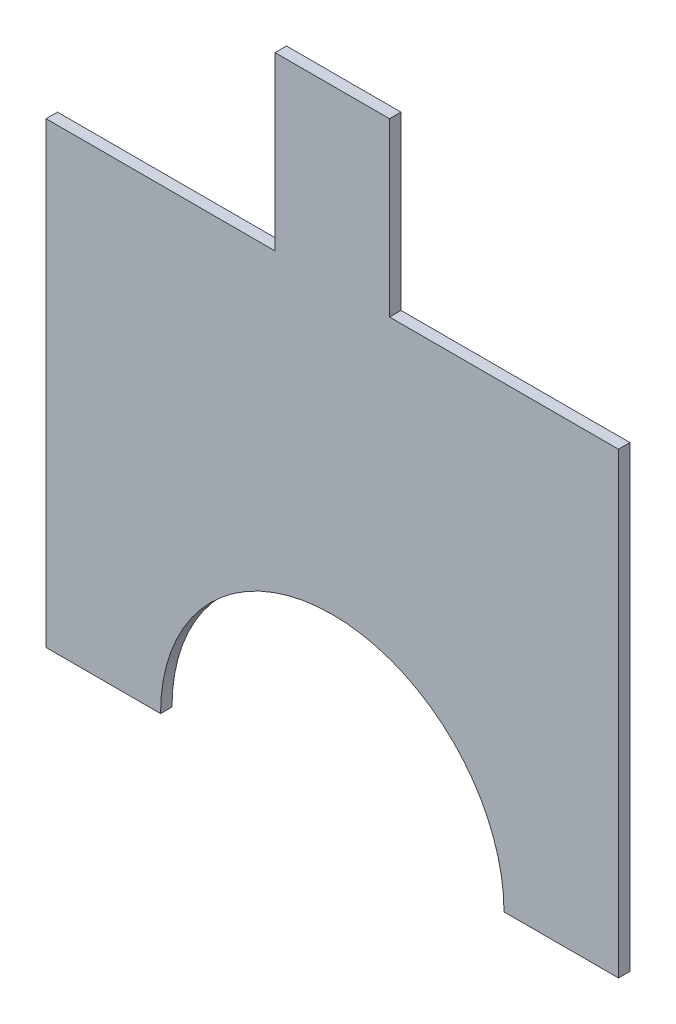
ISO-10303-21;
HEADER;
FILE_DESCRIPTION(('STEP AP214'),'2;1');
FILE_NAME('part.step','',(''),(''),'','','');
FILE_SCHEMA(('AUTOMOTIVE_DESIGN { 1 0 10303 214 1 1 1 1 }'));
ENDSEC;
DATA;
#1=APPLICATION_CONTEXT('core data for automotive mechanical design processes');
#2=APPLICATION_PROTOCOL_DEFINITION('international standard','automotive_design',2000,#1);
#3=PRODUCT_CONTEXT('',#1,'mechanical');
#4=PRODUCT('Part','Part','',(#3));
#5=PRODUCT_RELATED_PRODUCT_CATEGORY('part','',(#4));
#6=PRODUCT_DEFINITION_FORMATION('','',#4);
#7=PRODUCT_DEFINITION_CONTEXT('part definition',#1,'design');
#8=PRODUCT_DEFINITION('design','',#6,#7);
#9=PRODUCT_DEFINITION_SHAPE('','',#8);
#10=(LENGTH_UNIT() NAMED_UNIT(*) SI_UNIT(.MILLI.,.METRE.));
#11=(NAMED_UNIT(*) PLANE_ANGLE_UNIT() SI_UNIT($,.RADIAN.));
#12=(NAMED_UNIT(*) SI_UNIT($,.STERADIAN.) SOLID_ANGLE_UNIT());
#13=UNCERTAINTY_MEASURE_WITH_UNIT(LENGTH_MEASURE(1.E-05),#10,'distance_accuracy_value','');
#14=(GEOMETRIC_REPRESENTATION_CONTEXT(3) GLOBAL_UNCERTAINTY_ASSIGNED_CONTEXT((#13)) GLOBAL_UNIT_ASSIGNED_CONTEXT((#10,
#11,#12)) REPRESENTATION_CONTEXT('',''));
#15=CARTESIAN_POINT('',(0.,0.,0.));
#16=DIRECTION('',(0.,0.,1.));
#17=DIRECTION('',(1.,0.,0.));
#18=AXIS2_PLACEMENT_3D('',#15,#16,#17);
#19=CARTESIAN_POINT('',(-0.7,-0.800000000000001,0.01));
#20=DIRECTION('',(1.,0.,0.));
#21=DIRECTION('',(0.,0.,-1.));
#22=AXIS2_PLACEMENT_3D('',#19,#20,#21);
#23=PLANE('',#22);
#24=DIRECTION('',(0.,-1.,0.));
#25=VECTOR('',#24,1.);
#26=CARTESIAN_POINT('',(-0.7,-0.800000000000001,0.));
#27=LINE('',#26,#25);
#28=CARTESIAN_POINT('',(-0.7,-0.400000000000001,0.));
#29=VERTEX_POINT('',#28);
#30=CARTESIAN_POINT('',(-0.7,-0.800000000000001,0.));
#31=VERTEX_POINT('',#30);
#32=EDGE_CURVE('E11',#29,#31,#27,.T.);
#33=ORIENTED_EDGE('',*,*,#32,.T.);
#34=DIRECTION('',(0.,0.,-1.));
#35=VECTOR('',#34,1.);
#36=CARTESIAN_POINT('',(-0.7,-0.800000000000001,0.01));
#37=LINE('',#36,#35);
#38=CARTESIAN_POINT('',(-0.7,-0.800000000000001,0.01));
#39=VERTEX_POINT('',#38);
#40=EDGE_CURVE('E24',#39,#31,#37,.T.);
#41=ORIENTED_EDGE('',*,*,#40,.F.);
#42=DIRECTION('',(0.,-1.,0.));
#43=VECTOR('',#42,1.);
#44=CARTESIAN_POINT('',(-0.7,-0.800000000000001,0.01));
#45=LINE('',#44,#43);
#46=CARTESIAN_POINT('',(-0.7,-0.400000000000001,0.01));
#47=VERTEX_POINT('',#46);
#48=EDGE_CURVE('E171',#47,#39,#45,.T.);
#49=ORIENTED_EDGE('',*,*,#48,.F.);
#50=DIRECTION('',(0.,0.,-1.));
#51=VECTOR('',#50,1.);
#52=CARTESIAN_POINT('',(-0.7,-0.400000000000001,0.01));
#53=LINE('',#52,#51);
#54=EDGE_CURVE('E114',#47,#29,#53,.T.);
#55=ORIENTED_EDGE('',*,*,#54,.T.);
#56=EDGE_LOOP('',(#33,#41,#49,#55));
#57=FACE_BOUND('',#56,.T.);
#58=ADVANCED_FACE('F17',(#57),#23,.F.);
#59=CARTESIAN_POINT('',(-0.7,-0.800000000000001,0.01));
#60=DIRECTION('',(0.,1.,0.));
#61=DIRECTION('',(-1.,0.,0.));
#62=AXIS2_PLACEMENT_3D('',#59,#60,#61);
#63=PLANE('',#62);
#64=DIRECTION('',(1.,0.,0.));
#65=VECTOR('',#64,1.);
#66=CARTESIAN_POINT('',(-0.7,-0.800000000000001,0.));
#67=LINE('',#66,#65);
#68=CARTESIAN_POINT('',(-0.6,-0.800000000000001,0.));
#69=VERTEX_POINT('',#68);
#70=EDGE_CURVE('E168',#31,#69,#67,.T.);
#71=ORIENTED_EDGE('',*,*,#70,.T.);
#72=DIRECTION('',(0.,0.,-1.));
#73=VECTOR('',#72,1.);
#74=CARTESIAN_POINT('',(-0.6,-0.800000000000001,0.01));
#75=LINE('',#74,#73);
#76=CARTESIAN_POINT('',(-0.6,-0.800000000000001,0.01));
#77=VERTEX_POINT('',#76);
#78=EDGE_CURVE('E165',#77,#69,#75,.T.);
#79=ORIENTED_EDGE('',*,*,#78,.F.);
#80=DIRECTION('',(1.,0.,0.));
#81=VECTOR('',#80,1.);
#82=CARTESIAN_POINT('',(-0.7,-0.800000000000001,0.01));
#83=LINE('',#82,#81);
#84=EDGE_CURVE('E162',#39,#77,#83,.T.);
#85=ORIENTED_EDGE('',*,*,#84,.F.);
#86=ORIENTED_EDGE('',*,*,#40,.T.);
#87=EDGE_LOOP('',(#71,#79,#85,#86));
#88=FACE_BOUND('',#87,.T.);
#89=ADVANCED_FACE('F174',(#88),#63,.F.);
#90=CARTESIAN_POINT('',(-0.45,-0.800000000000001,0.01));
#91=DIRECTION('',(0.,0.,-1.));
#92=DIRECTION('',(-1.,0.,0.));
#93=AXIS2_PLACEMENT_3D('',#90,#91,#92);
#94=CYLINDRICAL_SURFACE('',#93,0.15);
#95=CARTESIAN_POINT('',(-0.45,-0.800000000000001,0.));
#96=DIRECTION('',(0.,0.,-1.));
#97=DIRECTION('',(-1.,0.,0.));
#98=AXIS2_PLACEMENT_3D('',#95,#96,#97);
#99=CIRCLE('',#98,0.15);
#100=CARTESIAN_POINT('',(-0.3,-0.800000000000001,0.));
#101=VERTEX_POINT('',#100);
#102=EDGE_CURVE('E159',#69,#101,#99,.T.);
#103=ORIENTED_EDGE('',*,*,#102,.T.);
#104=DIRECTION('',(0.,0.,-1.));
#105=VECTOR('',#104,1.);
#106=CARTESIAN_POINT('',(-0.3,-0.800000000000001,0.01));
#107=LINE('',#106,#105);
#108=CARTESIAN_POINT('',(-0.3,-0.800000000000001,0.01));
#109=VERTEX_POINT('',#108);
#110=EDGE_CURVE('E157',#109,#101,#107,.T.);
#111=ORIENTED_EDGE('',*,*,#110,.F.);
#112=CARTESIAN_POINT('',(-0.45,-0.800000000000001,0.01));
#113=DIRECTION('',(0.,0.,-1.));
#114=DIRECTION('',(-1.,0.,0.));
#115=AXIS2_PLACEMENT_3D('',#112,#113,#114);
#116=CIRCLE('',#115,0.15);
#117=EDGE_CURVE('E155',#77,#109,#116,.T.);
#118=ORIENTED_EDGE('',*,*,#117,.F.);
#119=ORIENTED_EDGE('',*,*,#78,.T.);
#120=EDGE_LOOP('',(#103,#111,#118,#119));
#121=FACE_BOUND('',#120,.T.);
#122=ADVANCED_FACE('F181',(#121),#94,.F.);
#123=CARTESIAN_POINT('',(-0.3,-0.800000000000001,0.01));
#124=DIRECTION('',(0.,1.,0.));
#125=DIRECTION('',(-1.,0.,0.));
#126=AXIS2_PLACEMENT_3D('',#123,#124,#125);
#127=PLANE('',#126);
#128=DIRECTION('',(1.,0.,0.));
#129=VECTOR('',#128,1.);
#130=CARTESIAN_POINT('',(-0.3,-0.800000000000001,0.));
#131=LINE('',#130,#129);
#132=CARTESIAN_POINT('',(-0.2,-0.800000000000001,0.));
#133=VERTEX_POINT('',#132);
#134=EDGE_CURVE('E153',#101,#133,#131,.T.);
#135=ORIENTED_EDGE('',*,*,#134,.T.);
#136=DIRECTION('',(0.,0.,-1.));
#137=VECTOR('',#136,1.);
#138=CARTESIAN_POINT('',(-0.2,-0.800000000000001,0.01));
#139=LINE('',#138,#137);
#140=CARTESIAN_POINT('',(-0.2,-0.800000000000001,0.01));
#141=VERTEX_POINT('',#140);
#142=EDGE_CURVE('E150',#141,#133,#139,.T.);
#143=ORIENTED_EDGE('',*,*,#142,.F.);
#144=DIRECTION('',(1.,0.,0.));
#145=VECTOR('',#144,1.);
#146=CARTESIAN_POINT('',(-0.3,-0.800000000000001,0.01));
#147=LINE('',#146,#145);
#148=EDGE_CURVE('E147',#109,#141,#147,.T.);
#149=ORIENTED_EDGE('',*,*,#148,.F.);
#150=ORIENTED_EDGE('',*,*,#110,.T.);
#151=EDGE_LOOP('',(#135,#143,#149,#150));
#152=FACE_BOUND('',#151,.T.);
#153=ADVANCED_FACE('F199',(#152),#127,.F.);
#154=CARTESIAN_POINT('',(-0.2,-0.400000000000001,0.01));
#155=DIRECTION('',(-1.,0.,0.));
#156=DIRECTION('',(0.,-1.,0.));
#157=AXIS2_PLACEMENT_3D('',#154,#155,#156);
#158=PLANE('',#157);
#159=DIRECTION('',(0.,1.,0.));
#160=VECTOR('',#159,1.);
#161=CARTESIAN_POINT('',(-0.2,-0.400000000000001,0.));
#162=LINE('',#161,#160);
#163=CARTESIAN_POINT('',(-0.2,-0.400000000000001,0.));
#164=VERTEX_POINT('',#163);
#165=EDGE_CURVE('E145',#133,#164,#162,.T.);
#166=ORIENTED_EDGE('',*,*,#165,.T.);
#167=DIRECTION('',(0.,0.,-1.));
#168=VECTOR('',#167,1.);
#169=CARTESIAN_POINT('',(-0.2,-0.400000000000001,0.01));
#170=LINE('',#169,#168);
#171=CARTESIAN_POINT('',(-0.2,-0.400000000000001,0.01));
#172=VERTEX_POINT('',#171);
#173=EDGE_CURVE('E142',#172,#164,#170,.T.);
#174=ORIENTED_EDGE('',*,*,#173,.F.);
#175=DIRECTION('',(0.,1.,0.));
#176=VECTOR('',#175,1.);
#177=CARTESIAN_POINT('',(-0.2,-0.400000000000001,0.01));
#178=LINE('',#177,#176);
#179=EDGE_CURVE('E139',#141,#172,#178,.T.);
#180=ORIENTED_EDGE('',*,*,#179,.F.);
#181=ORIENTED_EDGE('',*,*,#142,.T.);
#182=EDGE_LOOP('',(#166,#174,#180,#181));
#183=FACE_BOUND('',#182,.T.);
#184=ADVANCED_FACE('F197',(#183),#158,.F.);
#185=CARTESIAN_POINT('',(-0.4,-0.400000000000001,0.01));
#186=DIRECTION('',(0.,-1.,0.));
#187=DIRECTION('',(0.,0.,-1.));
#188=AXIS2_PLACEMENT_3D('',#185,#186,#187);
#189=PLANE('',#188);
#190=DIRECTION('',(-1.,0.,0.));
#191=VECTOR('',#190,1.);
#192=CARTESIAN_POINT('',(-0.4,-0.400000000000001,0.));
#193=LINE('',#192,#191);
#194=CARTESIAN_POINT('',(-0.4,-0.400000000000001,0.));
#195=VERTEX_POINT('',#194);
#196=EDGE_CURVE('E137',#164,#195,#193,.T.);
#197=ORIENTED_EDGE('',*,*,#196,.T.);
#198=DIRECTION('',(0.,0.,-1.));
#199=VECTOR('',#198,1.);
#200=CARTESIAN_POINT('',(-0.4,-0.400000000000001,0.01));
#201=LINE('',#200,#199);
#202=CARTESIAN_POINT('',(-0.4,-0.400000000000001,0.01));
#203=VERTEX_POINT('',#202);
#204=EDGE_CURVE('E134',#203,#195,#201,.T.);
#205=ORIENTED_EDGE('',*,*,#204,.F.);
#206=DIRECTION('',(-1.,0.,0.));
#207=VECTOR('',#206,1.);
#208=CARTESIAN_POINT('',(-0.4,-0.400000000000001,0.01));
#209=LINE('',#208,#207);
#210=EDGE_CURVE('E131',#172,#203,#209,.T.);
#211=ORIENTED_EDGE('',*,*,#210,.F.);
#212=ORIENTED_EDGE('',*,*,#173,.T.);
#213=EDGE_LOOP('',(#197,#205,#211,#212));
#214=FACE_BOUND('',#213,.T.);
#215=ADVANCED_FACE('F195',(#214),#189,.F.);
#216=CARTESIAN_POINT('',(-0.4,-0.250000000000001,0.01));
#217=DIRECTION('',(-1.,0.,0.));
#218=DIRECTION('',(0.,-1.,0.));
#219=AXIS2_PLACEMENT_3D('',#216,#217,#218);
#220=PLANE('',#219);
#221=DIRECTION('',(0.,1.,0.));
#222=VECTOR('',#221,1.);
#223=CARTESIAN_POINT('',(-0.4,-0.250000000000001,0.));
#224=LINE('',#223,#222);
#225=CARTESIAN_POINT('',(-0.4,-0.250000000000001,0.));
#226=VERTEX_POINT('',#225);
#227=EDGE_CURVE('E129',#195,#226,#224,.T.);
#228=ORIENTED_EDGE('',*,*,#227,.T.);
#229=DIRECTION('',(0.,0.,-1.));
#230=VECTOR('',#229,1.);
#231=CARTESIAN_POINT('',(-0.4,-0.250000000000001,0.01));
#232=LINE('',#231,#230);
#233=CARTESIAN_POINT('',(-0.4,-0.250000000000001,0.01));
#234=VERTEX_POINT('',#233);
#235=EDGE_CURVE('E126',#234,#226,#232,.T.);
#236=ORIENTED_EDGE('',*,*,#235,.F.);
#237=DIRECTION('',(0.,1.,0.));
#238=VECTOR('',#237,1.);
#239=CARTESIAN_POINT('',(-0.4,-0.250000000000001,0.01));
#240=LINE('',#239,#238);
#241=EDGE_CURVE('E124',#203,#234,#240,.T.);
#242=ORIENTED_EDGE('',*,*,#241,.F.);
#243=ORIENTED_EDGE('',*,*,#204,.T.);
#244=EDGE_LOOP('',(#228,#236,#242,#243));
#245=FACE_BOUND('',#244,.T.);
#246=ADVANCED_FACE('F191',(#245),#220,.F.);
#247=CARTESIAN_POINT('',(-0.5,-0.250000000000001,0.01));
#248=DIRECTION('',(0.,-1.,0.));
#249=DIRECTION('',(0.,0.,-1.));
#250=AXIS2_PLACEMENT_3D('',#247,#248,#249);
#251=PLANE('',#250);
#252=DIRECTION('',(-1.,0.,0.));
#253=VECTOR('',#252,1.);
#254=CARTESIAN_POINT('',(-0.5,-0.250000000000001,0.));
#255=LINE('',#254,#253);
#256=CARTESIAN_POINT('',(-0.5,-0.250000000000001,0.));
#257=VERTEX_POINT('',#256);
#258=EDGE_CURVE('E122',#226,#257,#255,.T.);
#259=ORIENTED_EDGE('',*,*,#258,.T.);
#260=DIRECTION('',(0.,0.,-1.));
#261=VECTOR('',#260,1.);
#262=CARTESIAN_POINT('',(-0.5,-0.250000000000001,0.01));
#263=LINE('',#262,#261);
#264=CARTESIAN_POINT('',(-0.5,-0.250000000000001,0.01));
#265=VERTEX_POINT('',#264);
#266=EDGE_CURVE('E120',#265,#257,#263,.T.);
#267=ORIENTED_EDGE('',*,*,#266,.F.);
#268=DIRECTION('',(-1.,0.,0.));
#269=VECTOR('',#268,1.);
#270=CARTESIAN_POINT('',(-0.5,-0.250000000000001,0.01));
#271=LINE('',#270,#269);
#272=EDGE_CURVE('E109',#234,#265,#271,.T.);
#273=ORIENTED_EDGE('',*,*,#272,.F.);
#274=ORIENTED_EDGE('',*,*,#235,.T.);
#275=EDGE_LOOP('',(#259,#267,#273,#274));
#276=FACE_BOUND('',#275,.T.);
#277=ADVANCED_FACE('F188',(#276),#251,.F.);
#278=CARTESIAN_POINT('',(-0.5,-0.400000000000001,0.01));
#279=DIRECTION('',(1.,0.,0.));
#280=DIRECTION('',(0.,0.,-1.));
#281=AXIS2_PLACEMENT_3D('',#278,#279,#280);
#282=PLANE('',#281);
#283=DIRECTION('',(0.,-1.,0.));
#284=VECTOR('',#283,1.);
#285=CARTESIAN_POINT('',(-0.5,-0.400000000000001,0.));
#286=LINE('',#285,#284);
#287=CARTESIAN_POINT('',(-0.5,-0.400000000000001,0.));
#288=VERTEX_POINT('',#287);
#289=EDGE_CURVE('E96',#257,#288,#286,.T.);
#290=ORIENTED_EDGE('',*,*,#289,.T.);
#291=DIRECTION('',(0.,0.,-1.));
#292=VECTOR('',#291,1.);
#293=CARTESIAN_POINT('',(-0.5,-0.400000000000001,0.01));
#294=LINE('',#293,#292);
#295=CARTESIAN_POINT('',(-0.5,-0.400000000000001,0.01));
#296=VERTEX_POINT('',#295);
#297=EDGE_CURVE('E90',#296,#288,#294,.T.);
#298=ORIENTED_EDGE('',*,*,#297,.F.);
#299=DIRECTION('',(0.,-1.,0.));
#300=VECTOR('',#299,1.);
#301=CARTESIAN_POINT('',(-0.5,-0.400000000000001,0.01));
#302=LINE('',#301,#300);
#303=EDGE_CURVE('E94',#265,#296,#302,.T.);
#304=ORIENTED_EDGE('',*,*,#303,.F.);
#305=ORIENTED_EDGE('',*,*,#266,.T.);
#306=EDGE_LOOP('',(#290,#298,#304,#305));
#307=FACE_BOUND('',#306,.T.);
#308=ADVANCED_FACE('F92',(#307),#282,.F.);
#309=CARTESIAN_POINT('',(-0.7,-0.400000000000001,0.01));
#310=DIRECTION('',(0.,-1.,0.));
#311=DIRECTION('',(0.,0.,-1.));
#312=AXIS2_PLACEMENT_3D('',#309,#310,#311);
#313=PLANE('',#312);
#314=DIRECTION('',(-1.,0.,0.));
#315=VECTOR('',#314,1.);
#316=CARTESIAN_POINT('',(-0.7,-0.400000000000001,0.));
#317=LINE('',#316,#315);
#318=EDGE_CURVE('E110',#288,#29,#317,.T.);
#319=ORIENTED_EDGE('',*,*,#318,.T.);
#320=ORIENTED_EDGE('',*,*,#54,.F.);
#321=DIRECTION('',(-1.,0.,0.));
#322=VECTOR('',#321,1.);
#323=CARTESIAN_POINT('',(-0.7,-0.400000000000001,0.01));
#324=LINE('',#323,#322);
#325=EDGE_CURVE('E106',#296,#47,#324,.T.);
#326=ORIENTED_EDGE('',*,*,#325,.F.);
#327=ORIENTED_EDGE('',*,*,#297,.T.);
#328=EDGE_LOOP('',(#319,#320,#326,#327));
#329=FACE_BOUND('',#328,.T.);
#330=ADVANCED_FACE('F113',(#329),#313,.F.);
#331=CARTESIAN_POINT('',(-0.45,-0.800000000000001,0.01));
#332=DIRECTION('',(0.,0.,-1.));
#333=DIRECTION('',(-1.,0.,0.));
#334=AXIS2_PLACEMENT_3D('',#331,#332,#333);
#335=PLANE('',#334);
#336=ORIENTED_EDGE('',*,*,#48,.T.);
#337=ORIENTED_EDGE('',*,*,#84,.T.);
#338=ORIENTED_EDGE('',*,*,#117,.T.);
#339=ORIENTED_EDGE('',*,*,#148,.T.);
#340=ORIENTED_EDGE('',*,*,#179,.T.);
#341=ORIENTED_EDGE('',*,*,#210,.T.);
#342=ORIENTED_EDGE('',*,*,#241,.T.);
#343=ORIENTED_EDGE('',*,*,#272,.T.);
#344=ORIENTED_EDGE('',*,*,#303,.T.);
#345=ORIENTED_EDGE('',*,*,#325,.T.);
#346=EDGE_LOOP('',(#336,#337,#338,#339,#340,#341,#342,#343,#344,#345));
#347=FACE_BOUND('',#346,.T.);
#348=ADVANCED_FACE('F105',(#347),#335,.F.);
#349=CARTESIAN_POINT('',(-0.45,-0.800000000000001,0.));
#350=DIRECTION('',(0.,0.,-1.));
#351=DIRECTION('',(-1.,0.,0.));
#352=AXIS2_PLACEMENT_3D('',#349,#350,#351);
#353=PLANE('',#352);
#354=ORIENTED_EDGE('',*,*,#32,.F.);
#355=ORIENTED_EDGE('',*,*,#318,.F.);
#356=ORIENTED_EDGE('',*,*,#289,.F.);
#357=ORIENTED_EDGE('',*,*,#258,.F.);
#358=ORIENTED_EDGE('',*,*,#227,.F.);
#359=ORIENTED_EDGE('',*,*,#196,.F.);
#360=ORIENTED_EDGE('',*,*,#165,.F.);
#361=ORIENTED_EDGE('',*,*,#134,.F.);
#362=ORIENTED_EDGE('',*,*,#102,.F.);
#363=ORIENTED_EDGE('',*,*,#70,.F.);
#364=EDGE_LOOP('',(#354,#355,#356,#357,#358,#359,#360,#361,#362,#363));
#365=FACE_BOUND('',#364,.T.);
#366=ADVANCED_FACE('F176',(#365),#353,.T.);
#367=CLOSED_SHELL('',(#58,#89,#122,#153,#184,#215,#246,#277,#308,#330,#348,#366));
#368=MANIFOLD_SOLID_BREP('B1',#367);
#369=ADVANCED_BREP_SHAPE_REPRESENTATION('',(#18,#368),#14);
#370=SHAPE_DEFINITION_REPRESENTATION(#9,#369);
ENDSEC;
END-ISO-10303-21;
